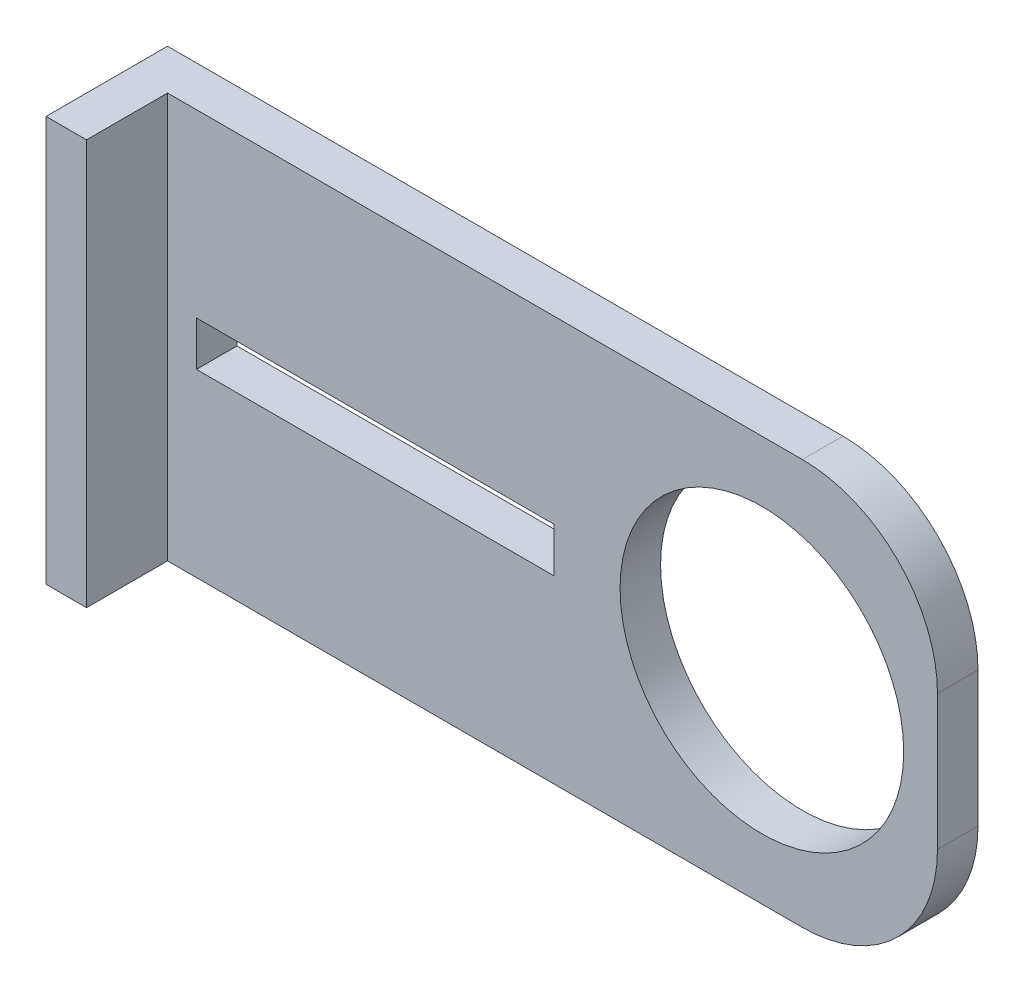
ISO-10303-21;
HEADER;
FILE_DESCRIPTION(('STEP AP214'),'2;1');
FILE_NAME('part.step','',(''),(''),'','','');
FILE_SCHEMA(('AUTOMOTIVE_DESIGN { 1 0 10303 214 1 1 1 1 }'));
ENDSEC;
DATA;
#1=APPLICATION_CONTEXT('core data for automotive mechanical design processes');
#2=APPLICATION_PROTOCOL_DEFINITION('international standard','automotive_design',2000,#1);
#3=PRODUCT_CONTEXT('',#1,'mechanical');
#4=PRODUCT('Part','Part','',(#3));
#5=PRODUCT_RELATED_PRODUCT_CATEGORY('part','',(#4));
#6=PRODUCT_DEFINITION_FORMATION('','',#4);
#7=PRODUCT_DEFINITION_CONTEXT('part definition',#1,'design');
#8=PRODUCT_DEFINITION('design','',#6,#7);
#9=PRODUCT_DEFINITION_SHAPE('','',#8);
#10=(LENGTH_UNIT() NAMED_UNIT(*) SI_UNIT(.MILLI.,.METRE.));
#11=(NAMED_UNIT(*) PLANE_ANGLE_UNIT() SI_UNIT($,.RADIAN.));
#12=(NAMED_UNIT(*) SI_UNIT($,.STERADIAN.) SOLID_ANGLE_UNIT());
#13=UNCERTAINTY_MEASURE_WITH_UNIT(LENGTH_MEASURE(1.E-05),#10,'distance_accuracy_value','');
#14=(GEOMETRIC_REPRESENTATION_CONTEXT(3) GLOBAL_UNCERTAINTY_ASSIGNED_CONTEXT((#13)) GLOBAL_UNIT_ASSIGNED_CONTEXT((#10,
#11,#12)) REPRESENTATION_CONTEXT('',''));
#15=CARTESIAN_POINT('',(0.,0.,0.));
#16=DIRECTION('',(0.,0.,1.));
#17=DIRECTION('',(1.,0.,0.));
#18=AXIS2_PLACEMENT_3D('',#15,#16,#17);
#19=CARTESIAN_POINT('',(0.,0.,3.));
#20=DIRECTION('',(0.,0.,-1.));
#21=DIRECTION('',(-1.,0.,0.));
#22=AXIS2_PLACEMENT_3D('',#19,#20,#21);
#23=PLANE('',#22);
#24=DIRECTION('',(1.,0.,0.));
#25=VECTOR('',#24,1.);
#26=CARTESIAN_POINT('',(31.60513234962,13.35,3.));
#27=LINE('',#26,#25);
#28=CARTESIAN_POINT('',(5.14102965433932,13.35,3.));
#29=VERTEX_POINT('',#28);
#30=CARTESIAN_POINT('',(31.60513234962,13.35,3.));
#31=VERTEX_POINT('',#30);
#32=EDGE_CURVE('E147',#29,#31,#27,.T.);
#33=ORIENTED_EDGE('',*,*,#32,.F.);
#34=DIRECTION('',(0.,-1.,0.));
#35=VECTOR('',#34,1.);
#36=CARTESIAN_POINT('',(5.14102965433932,16.65,3.));
#37=LINE('',#36,#35);
#38=CARTESIAN_POINT('',(5.14102965433932,16.65,3.));
#39=VERTEX_POINT('',#38);
#40=EDGE_CURVE('E61',#39,#29,#37,.T.);
#41=ORIENTED_EDGE('',*,*,#40,.F.);
#42=DIRECTION('',(-1.,0.,0.));
#43=VECTOR('',#42,1.);
#44=CARTESIAN_POINT('',(31.60513234962,16.65,3.));
#45=LINE('',#44,#43);
#46=CARTESIAN_POINT('',(31.60513234962,16.65,3.));
#47=VERTEX_POINT('',#46);
#48=EDGE_CURVE('E154',#47,#39,#45,.T.);
#49=ORIENTED_EDGE('',*,*,#48,.F.);
#50=DIRECTION('',(0.,1.,0.));
#51=VECTOR('',#50,1.);
#52=CARTESIAN_POINT('',(31.60513234962,16.65,3.));
#53=LINE('',#52,#51);
#54=EDGE_CURVE('E137',#31,#47,#53,.T.);
#55=ORIENTED_EDGE('',*,*,#54,.F.);
#56=EDGE_LOOP('',(#33,#41,#49,#55));
#57=FACE_BOUND('',#56,.T.);
#58=CARTESIAN_POINT('',(47.,15.,3.));
#59=DIRECTION('',(0.,0.,1.));
#60=DIRECTION('',(1.,0.,0.));
#61=AXIS2_PLACEMENT_3D('',#58,#59,#60);
#62=CIRCLE('',#61,10.5);
#63=CARTESIAN_POINT('',(57.5,15.,3.));
#64=VERTEX_POINT('',#63);
#65=EDGE_CURVE('E166',#64,#64,#62,.T.);
#66=ORIENTED_EDGE('',*,*,#65,.F.);
#67=EDGE_LOOP('',(#66));
#68=FACE_BOUND('',#67,.T.);
#69=DIRECTION('',(1.,0.,0.));
#70=VECTOR('',#69,1.);
#71=CARTESIAN_POINT('',(0.,0.,3.));
#72=LINE('',#71,#70);
#73=CARTESIAN_POINT('',(3.,0.,3.));
#74=VERTEX_POINT('',#73);
#75=CARTESIAN_POINT('',(50.,0.,3.));
#76=VERTEX_POINT('',#75);
#77=EDGE_CURVE('E202',#74,#76,#72,.T.);
#78=ORIENTED_EDGE('',*,*,#77,.T.);
#79=CARTESIAN_POINT('',(50.,10.,3.));
#80=DIRECTION('',(0.,0.,-1.));
#81=DIRECTION('',(-1.,0.,0.));
#82=AXIS2_PLACEMENT_3D('',#79,#80,#81);
#83=CIRCLE('',#82,10.);
#84=CARTESIAN_POINT('',(60.,10.,3.));
#85=VERTEX_POINT('',#84);
#86=EDGE_CURVE('E256',#76,#85,#83,.F.);
#87=ORIENTED_EDGE('',*,*,#86,.T.);
#88=DIRECTION('',(0.,1.,0.));
#89=VECTOR('',#88,1.);
#90=CARTESIAN_POINT('',(60.,0.,3.));
#91=LINE('',#90,#89);
#92=CARTESIAN_POINT('',(60.,20.,3.));
#93=VERTEX_POINT('',#92);
#94=EDGE_CURVE('E206',#85,#93,#91,.T.);
#95=ORIENTED_EDGE('',*,*,#94,.T.);
#96=CARTESIAN_POINT('',(50.,20.,3.));
#97=DIRECTION('',(0.,0.,-1.));
#98=DIRECTION('',(-1.,0.,0.));
#99=AXIS2_PLACEMENT_3D('',#96,#97,#98);
#100=CIRCLE('',#99,10.);
#101=CARTESIAN_POINT('',(50.,30.,3.));
#102=VERTEX_POINT('',#101);
#103=EDGE_CURVE('E253',#93,#102,#100,.F.);
#104=ORIENTED_EDGE('',*,*,#103,.T.);
#105=DIRECTION('',(-1.,0.,0.));
#106=VECTOR('',#105,1.);
#107=CARTESIAN_POINT('',(0.,30.,3.));
#108=LINE('',#107,#106);
#109=CARTESIAN_POINT('',(3.,30.,3.));
#110=VERTEX_POINT('',#109);
#111=EDGE_CURVE('E210',#102,#110,#108,.T.);
#112=ORIENTED_EDGE('',*,*,#111,.T.);
#113=DIRECTION('',(0.,1.,0.));
#114=VECTOR('',#113,1.);
#115=CARTESIAN_POINT('',(3.,30.,3.));
#116=LINE('',#115,#114);
#117=EDGE_CURVE('E180',#74,#110,#116,.T.);
#118=ORIENTED_EDGE('',*,*,#117,.F.);
#119=EDGE_LOOP('',(#78,#87,#95,#104,#112,#118));
#120=FACE_BOUND('',#119,.T.);
#121=ADVANCED_FACE('F45',(#57,#68,#120),#23,.F.);
#122=CARTESIAN_POINT('',(0.,0.,3.));
#123=DIRECTION('',(1.,0.,0.));
#124=DIRECTION('',(0.,0.,-1.));
#125=AXIS2_PLACEMENT_3D('',#122,#123,#124);
#126=PLANE('',#125);
#127=DIRECTION('',(0.,-1.,0.));
#128=VECTOR('',#127,1.);
#129=CARTESIAN_POINT('',(0.,0.,0.));
#130=LINE('',#129,#128);
#131=CARTESIAN_POINT('',(0.,30.,0.));
#132=VERTEX_POINT('',#131);
#133=CARTESIAN_POINT('',(0.,0.,0.));
#134=VERTEX_POINT('',#133);
#135=EDGE_CURVE('E201',#132,#134,#130,.T.);
#136=ORIENTED_EDGE('',*,*,#135,.T.);
#137=DIRECTION('',(0.,0.,-1.));
#138=VECTOR('',#137,1.);
#139=CARTESIAN_POINT('',(0.,0.,3.));
#140=LINE('',#139,#138);
#141=CARTESIAN_POINT('',(0.,0.,9.));
#142=VERTEX_POINT('',#141);
#143=EDGE_CURVE('E230',#142,#134,#140,.T.);
#144=ORIENTED_EDGE('',*,*,#143,.F.);
#145=DIRECTION('',(0.,-1.,0.));
#146=VECTOR('',#145,1.);
#147=CARTESIAN_POINT('',(0.,30.,9.));
#148=LINE('',#147,#146);
#149=CARTESIAN_POINT('',(0.,30.,9.));
#150=VERTEX_POINT('',#149);
#151=EDGE_CURVE('E175',#150,#142,#148,.T.);
#152=ORIENTED_EDGE('',*,*,#151,.F.);
#153=DIRECTION('',(0.,0.,-1.));
#154=VECTOR('',#153,1.);
#155=CARTESIAN_POINT('',(0.,30.,3.));
#156=LINE('',#155,#154);
#157=EDGE_CURVE('E213',#150,#132,#156,.T.);
#158=ORIENTED_EDGE('',*,*,#157,.T.);
#159=EDGE_LOOP('',(#136,#144,#152,#158));
#160=FACE_BOUND('',#159,.T.);
#161=ADVANCED_FACE('F288',(#160),#126,.F.);
#162=CARTESIAN_POINT('',(0.,0.,3.));
#163=DIRECTION('',(0.,1.,0.));
#164=DIRECTION('',(0.,0.,1.));
#165=AXIS2_PLACEMENT_3D('',#162,#163,#164);
#166=PLANE('',#165);
#167=DIRECTION('',(1.,0.,0.));
#168=VECTOR('',#167,1.);
#169=CARTESIAN_POINT('',(0.,0.,0.));
#170=LINE('',#169,#168);
#171=CARTESIAN_POINT('',(50.,0.,0.));
#172=VERTEX_POINT('',#171);
#173=EDGE_CURVE('E217',#134,#172,#170,.T.);
#174=ORIENTED_EDGE('',*,*,#173,.T.);
#175=DIRECTION('',(0.,0.,-1.));
#176=VECTOR('',#175,1.);
#177=CARTESIAN_POINT('',(50.,0.,3.));
#178=LINE('',#177,#176);
#179=EDGE_CURVE('E250',#172,#76,#178,.F.);
#180=ORIENTED_EDGE('',*,*,#179,.T.);
#181=ORIENTED_EDGE('',*,*,#77,.F.);
#182=DIRECTION('',(0.,0.,-1.));
#183=VECTOR('',#182,1.);
#184=CARTESIAN_POINT('',(3.,0.,9.));
#185=LINE('',#184,#183);
#186=CARTESIAN_POINT('',(3.,0.,9.));
#187=VERTEX_POINT('',#186);
#188=EDGE_CURVE('E197',#187,#74,#185,.T.);
#189=ORIENTED_EDGE('',*,*,#188,.F.);
#190=DIRECTION('',(1.,0.,0.));
#191=VECTOR('',#190,1.);
#192=CARTESIAN_POINT('',(0.,0.,9.));
#193=LINE('',#192,#191);
#194=EDGE_CURVE('E179',#142,#187,#193,.T.);
#195=ORIENTED_EDGE('',*,*,#194,.F.);
#196=ORIENTED_EDGE('',*,*,#143,.T.);
#197=EDGE_LOOP('',(#174,#180,#181,#189,#195,#196));
#198=FACE_BOUND('',#197,.T.);
#199=ADVANCED_FACE('F292',(#198),#166,.F.);
#200=CARTESIAN_POINT('',(60.,0.,3.));
#201=DIRECTION('',(-1.,0.,0.));
#202=DIRECTION('',(0.,0.,1.));
#203=AXIS2_PLACEMENT_3D('',#200,#201,#202);
#204=PLANE('',#203);
#205=ORIENTED_EDGE('',*,*,#94,.F.);
#206=DIRECTION('',(0.,0.,-1.));
#207=VECTOR('',#206,1.);
#208=CARTESIAN_POINT('',(60.,10.,3.));
#209=LINE('',#208,#207);
#210=CARTESIAN_POINT('',(60.,10.,0.));
#211=VERTEX_POINT('',#210);
#212=EDGE_CURVE('E240',#85,#211,#209,.T.);
#213=ORIENTED_EDGE('',*,*,#212,.T.);
#214=DIRECTION('',(0.,1.,0.));
#215=VECTOR('',#214,1.);
#216=CARTESIAN_POINT('',(60.,0.,0.));
#217=LINE('',#216,#215);
#218=CARTESIAN_POINT('',(60.,20.,0.));
#219=VERTEX_POINT('',#218);
#220=EDGE_CURVE('E221',#211,#219,#217,.T.);
#221=ORIENTED_EDGE('',*,*,#220,.T.);
#222=DIRECTION('',(0.,0.,-1.));
#223=VECTOR('',#222,1.);
#224=CARTESIAN_POINT('',(60.,20.,3.));
#225=LINE('',#224,#223);
#226=EDGE_CURVE('E234',#219,#93,#225,.F.);
#227=ORIENTED_EDGE('',*,*,#226,.T.);
#228=EDGE_LOOP('',(#205,#213,#221,#227));
#229=FACE_BOUND('',#228,.T.);
#230=ADVANCED_FACE('F304',(#229),#204,.F.);
#231=CARTESIAN_POINT('',(0.,30.,3.));
#232=DIRECTION('',(0.,-1.,0.));
#233=DIRECTION('',(0.,0.,-1.));
#234=AXIS2_PLACEMENT_3D('',#231,#232,#233);
#235=PLANE('',#234);
#236=ORIENTED_EDGE('',*,*,#111,.F.);
#237=DIRECTION('',(0.,0.,-1.));
#238=VECTOR('',#237,1.);
#239=CARTESIAN_POINT('',(50.,30.,3.));
#240=LINE('',#239,#238);
#241=CARTESIAN_POINT('',(50.,30.,0.));
#242=VERTEX_POINT('',#241);
#243=EDGE_CURVE('E259',#102,#242,#240,.T.);
#244=ORIENTED_EDGE('',*,*,#243,.T.);
#245=DIRECTION('',(-1.,0.,0.));
#246=VECTOR('',#245,1.);
#247=CARTESIAN_POINT('',(0.,30.,0.));
#248=LINE('',#247,#246);
#249=EDGE_CURVE('E207',#242,#132,#248,.T.);
#250=ORIENTED_EDGE('',*,*,#249,.T.);
#251=ORIENTED_EDGE('',*,*,#157,.F.);
#252=DIRECTION('',(-1.,0.,0.));
#253=VECTOR('',#252,1.);
#254=CARTESIAN_POINT('',(0.,30.,9.));
#255=LINE('',#254,#253);
#256=CARTESIAN_POINT('',(3.,30.,9.));
#257=VERTEX_POINT('',#256);
#258=EDGE_CURVE('E186',#257,#150,#255,.T.);
#259=ORIENTED_EDGE('',*,*,#258,.F.);
#260=DIRECTION('',(0.,0.,-1.));
#261=VECTOR('',#260,1.);
#262=CARTESIAN_POINT('',(3.,30.,9.));
#263=LINE('',#262,#261);
#264=EDGE_CURVE('E190',#257,#110,#263,.T.);
#265=ORIENTED_EDGE('',*,*,#264,.T.);
#266=EDGE_LOOP('',(#236,#244,#250,#251,#259,#265));
#267=FACE_BOUND('',#266,.T.);
#268=ADVANCED_FACE('F301',(#267),#235,.F.);
#269=CARTESIAN_POINT('',(0.,0.,0.));
#270=DIRECTION('',(0.,0.,-1.));
#271=DIRECTION('',(-1.,0.,0.));
#272=AXIS2_PLACEMENT_3D('',#269,#270,#271);
#273=PLANE('',#272);
#274=DIRECTION('',(0.,1.,0.));
#275=VECTOR('',#274,1.);
#276=CARTESIAN_POINT('',(5.14102965433932,0.,0.));
#277=LINE('',#276,#275);
#278=CARTESIAN_POINT('',(5.14102965433932,13.35,0.));
#279=VERTEX_POINT('',#278);
#280=CARTESIAN_POINT('',(5.14102965433932,16.65,0.));
#281=VERTEX_POINT('',#280);
#282=EDGE_CURVE('E11',#279,#281,#277,.T.);
#283=ORIENTED_EDGE('',*,*,#282,.F.);
#284=DIRECTION('',(-1.,0.,0.));
#285=VECTOR('',#284,1.);
#286=CARTESIAN_POINT('',(0.,13.35,0.));
#287=LINE('',#286,#285);
#288=CARTESIAN_POINT('',(31.60513234962,13.35,0.));
#289=VERTEX_POINT('',#288);
#290=EDGE_CURVE('E263',#289,#279,#287,.T.);
#291=ORIENTED_EDGE('',*,*,#290,.F.);
#292=DIRECTION('',(0.,-1.,0.));
#293=VECTOR('',#292,1.);
#294=CARTESIAN_POINT('',(31.60513234962,0.,0.));
#295=LINE('',#294,#293);
#296=CARTESIAN_POINT('',(31.60513234962,16.65,0.));
#297=VERTEX_POINT('',#296);
#298=EDGE_CURVE('E140',#297,#289,#295,.T.);
#299=ORIENTED_EDGE('',*,*,#298,.F.);
#300=DIRECTION('',(1.,0.,0.));
#301=VECTOR('',#300,1.);
#302=CARTESIAN_POINT('',(0.,16.65,0.));
#303=LINE('',#302,#301);
#304=EDGE_CURVE('E54',#281,#297,#303,.T.);
#305=ORIENTED_EDGE('',*,*,#304,.F.);
#306=EDGE_LOOP('',(#283,#291,#299,#305));
#307=FACE_BOUND('',#306,.T.);
#308=CARTESIAN_POINT('',(47.,15.,0.));
#309=DIRECTION('',(0.,0.,-1.));
#310=DIRECTION('',(-1.,0.,0.));
#311=AXIS2_PLACEMENT_3D('',#308,#309,#310);
#312=CIRCLE('',#311,10.5);
#313=CARTESIAN_POINT('',(36.5,15.,0.));
#314=VERTEX_POINT('',#313);
#315=EDGE_CURVE('E174',#314,#314,#312,.T.);
#316=ORIENTED_EDGE('',*,*,#315,.F.);
#317=EDGE_LOOP('',(#316));
#318=FACE_BOUND('',#317,.T.);
#319=ORIENTED_EDGE('',*,*,#220,.F.);
#320=CARTESIAN_POINT('',(50.,10.,0.));
#321=DIRECTION('',(0.,0.,-1.));
#322=DIRECTION('',(-1.,0.,0.));
#323=AXIS2_PLACEMENT_3D('',#320,#321,#322);
#324=CIRCLE('',#323,10.);
#325=EDGE_CURVE('E247',#211,#172,#324,.T.);
#326=ORIENTED_EDGE('',*,*,#325,.T.);
#327=ORIENTED_EDGE('',*,*,#173,.F.);
#328=ORIENTED_EDGE('',*,*,#135,.F.);
#329=ORIENTED_EDGE('',*,*,#249,.F.);
#330=CARTESIAN_POINT('',(50.,20.,0.));
#331=DIRECTION('',(0.,0.,-1.));
#332=DIRECTION('',(-1.,0.,0.));
#333=AXIS2_PLACEMENT_3D('',#330,#331,#332);
#334=CIRCLE('',#333,10.);
#335=EDGE_CURVE('E244',#242,#219,#334,.T.);
#336=ORIENTED_EDGE('',*,*,#335,.T.);
#337=EDGE_LOOP('',(#319,#326,#327,#328,#329,#336));
#338=FACE_BOUND('',#337,.T.);
#339=ADVANCED_FACE('F273',(#307,#318,#338),#273,.T.);
#340=CARTESIAN_POINT('',(3.,30.,9.));
#341=DIRECTION('',(-1.,0.,0.));
#342=DIRECTION('',(0.,-1.,0.));
#343=AXIS2_PLACEMENT_3D('',#340,#341,#342);
#344=PLANE('',#343);
#345=ORIENTED_EDGE('',*,*,#117,.T.);
#346=ORIENTED_EDGE('',*,*,#264,.F.);
#347=DIRECTION('',(0.,1.,0.));
#348=VECTOR('',#347,1.);
#349=CARTESIAN_POINT('',(3.,30.,9.));
#350=LINE('',#349,#348);
#351=EDGE_CURVE('E183',#187,#257,#350,.T.);
#352=ORIENTED_EDGE('',*,*,#351,.F.);
#353=ORIENTED_EDGE('',*,*,#188,.T.);
#354=EDGE_LOOP('',(#345,#346,#352,#353));
#355=FACE_BOUND('',#354,.T.);
#356=ADVANCED_FACE('F297',(#355),#344,.F.);
#357=CARTESIAN_POINT('',(0.,0.,9.));
#358=DIRECTION('',(0.,0.,1.));
#359=DIRECTION('',(1.,0.,0.));
#360=AXIS2_PLACEMENT_3D('',#357,#358,#359);
#361=PLANE('',#360);
#362=ORIENTED_EDGE('',*,*,#151,.T.);
#363=ORIENTED_EDGE('',*,*,#194,.T.);
#364=ORIENTED_EDGE('',*,*,#351,.T.);
#365=ORIENTED_EDGE('',*,*,#258,.T.);
#366=EDGE_LOOP('',(#362,#363,#364,#365));
#367=FACE_BOUND('',#366,.T.);
#368=ADVANCED_FACE('F316',(#367),#361,.T.);
#369=CARTESIAN_POINT('',(47.,15.,-3.));
#370=DIRECTION('',(0.,0.,1.));
#371=DIRECTION('',(1.,0.,0.));
#372=AXIS2_PLACEMENT_3D('',#369,#370,#371);
#373=CYLINDRICAL_SURFACE('',#372,10.5);
#374=ORIENTED_EDGE('',*,*,#315,.T.);
#375=EDGE_LOOP('',(#374));
#376=FACE_BOUND('',#375,.T.);
#377=ORIENTED_EDGE('',*,*,#65,.T.);
#378=EDGE_LOOP('',(#377));
#379=FACE_BOUND('',#378,.T.);
#380=ADVANCED_FACE('F312',(#376,#379),#373,.F.);
#381=CARTESIAN_POINT('',(50.,10.,3.));
#382=DIRECTION('',(0.,0.,-1.));
#383=DIRECTION('',(-1.,0.,0.));
#384=AXIS2_PLACEMENT_3D('',#381,#382,#383);
#385=CYLINDRICAL_SURFACE('',#384,10.);
#386=ORIENTED_EDGE('',*,*,#86,.F.);
#387=ORIENTED_EDGE('',*,*,#179,.F.);
#388=ORIENTED_EDGE('',*,*,#325,.F.);
#389=ORIENTED_EDGE('',*,*,#212,.F.);
#390=EDGE_LOOP('',(#386,#387,#388,#389));
#391=FACE_BOUND('',#390,.T.);
#392=ADVANCED_FACE('F283',(#391),#385,.T.);
#393=CARTESIAN_POINT('',(50.,20.,3.));
#394=DIRECTION('',(0.,0.,-1.));
#395=DIRECTION('',(-1.,0.,0.));
#396=AXIS2_PLACEMENT_3D('',#393,#394,#395);
#397=CYLINDRICAL_SURFACE('',#396,10.);
#398=ORIENTED_EDGE('',*,*,#103,.F.);
#399=ORIENTED_EDGE('',*,*,#226,.F.);
#400=ORIENTED_EDGE('',*,*,#335,.F.);
#401=ORIENTED_EDGE('',*,*,#243,.F.);
#402=EDGE_LOOP('',(#398,#399,#400,#401));
#403=FACE_BOUND('',#402,.T.);
#404=ADVANCED_FACE('F47',(#403),#397,.T.);
#405=CARTESIAN_POINT('',(5.14102965433932,16.65,-3.));
#406=DIRECTION('',(-1.,0.,0.));
#407=DIRECTION('',(0.,0.,1.));
#408=AXIS2_PLACEMENT_3D('',#405,#406,#407);
#409=PLANE('',#408);
#410=ORIENTED_EDGE('',*,*,#282,.T.);
#411=DIRECTION('',(0.,0.,1.));
#412=VECTOR('',#411,1.);
#413=CARTESIAN_POINT('',(5.14102965433932,16.65,-3.));
#414=LINE('',#413,#412);
#415=EDGE_CURVE('E163',#281,#39,#414,.T.);
#416=ORIENTED_EDGE('',*,*,#415,.T.);
#417=ORIENTED_EDGE('',*,*,#40,.T.);
#418=DIRECTION('',(0.,0.,1.));
#419=VECTOR('',#418,1.);
#420=CARTESIAN_POINT('',(5.14102965433932,13.35,-3.));
#421=LINE('',#420,#419);
#422=EDGE_CURVE('E144',#279,#29,#421,.T.);
#423=ORIENTED_EDGE('',*,*,#422,.F.);
#424=EDGE_LOOP('',(#410,#416,#417,#423));
#425=FACE_BOUND('',#424,.T.);
#426=ADVANCED_FACE('F275',(#425),#409,.F.);
#427=CARTESIAN_POINT('',(31.60513234962,16.65,-3.));
#428=DIRECTION('',(0.,1.,0.));
#429=DIRECTION('',(0.,0.,1.));
#430=AXIS2_PLACEMENT_3D('',#427,#428,#429);
#431=PLANE('',#430);
#432=ORIENTED_EDGE('',*,*,#304,.T.);
#433=DIRECTION('',(0.,0.,1.));
#434=VECTOR('',#433,1.);
#435=CARTESIAN_POINT('',(31.60513234962,16.65,-3.));
#436=LINE('',#435,#434);
#437=EDGE_CURVE('E143',#297,#47,#436,.T.);
#438=ORIENTED_EDGE('',*,*,#437,.T.);
#439=ORIENTED_EDGE('',*,*,#48,.T.);
#440=ORIENTED_EDGE('',*,*,#415,.F.);
#441=EDGE_LOOP('',(#432,#438,#439,#440));
#442=FACE_BOUND('',#441,.T.);
#443=ADVANCED_FACE('F270',(#442),#431,.F.);
#444=CARTESIAN_POINT('',(31.60513234962,16.65,-3.));
#445=DIRECTION('',(1.,0.,0.));
#446=DIRECTION('',(0.,0.,-1.));
#447=AXIS2_PLACEMENT_3D('',#444,#445,#446);
#448=PLANE('',#447);
#449=ORIENTED_EDGE('',*,*,#298,.T.);
#450=DIRECTION('',(0.,0.,1.));
#451=VECTOR('',#450,1.);
#452=CARTESIAN_POINT('',(31.60513234962,13.35,-3.));
#453=LINE('',#452,#451);
#454=EDGE_CURVE('E69',#289,#31,#453,.T.);
#455=ORIENTED_EDGE('',*,*,#454,.T.);
#456=ORIENTED_EDGE('',*,*,#54,.T.);
#457=ORIENTED_EDGE('',*,*,#437,.F.);
#458=EDGE_LOOP('',(#449,#455,#456,#457));
#459=FACE_BOUND('',#458,.T.);
#460=ADVANCED_FACE('F134',(#459),#448,.F.);
#461=CARTESIAN_POINT('',(31.60513234962,13.35,-3.));
#462=DIRECTION('',(0.,-1.,0.));
#463=DIRECTION('',(0.,0.,-1.));
#464=AXIS2_PLACEMENT_3D('',#461,#462,#463);
#465=PLANE('',#464);
#466=ORIENTED_EDGE('',*,*,#290,.T.);
#467=ORIENTED_EDGE('',*,*,#422,.T.);
#468=ORIENTED_EDGE('',*,*,#32,.T.);
#469=ORIENTED_EDGE('',*,*,#454,.F.);
#470=EDGE_LOOP('',(#466,#467,#468,#469));
#471=FACE_BOUND('',#470,.T.);
#472=ADVANCED_FACE('F148',(#471),#465,.F.);
#473=CLOSED_SHELL('',(#121,#161,#199,#230,#268,#339,#356,#368,#380,#392,#404,#426,#443,#460,#472));
#474=MANIFOLD_SOLID_BREP('B2',#473);
#475=ADVANCED_BREP_SHAPE_REPRESENTATION('',(#18,#474),#14);
#476=SHAPE_DEFINITION_REPRESENTATION(#9,#475);
ENDSEC;
END-ISO-10303-21;
